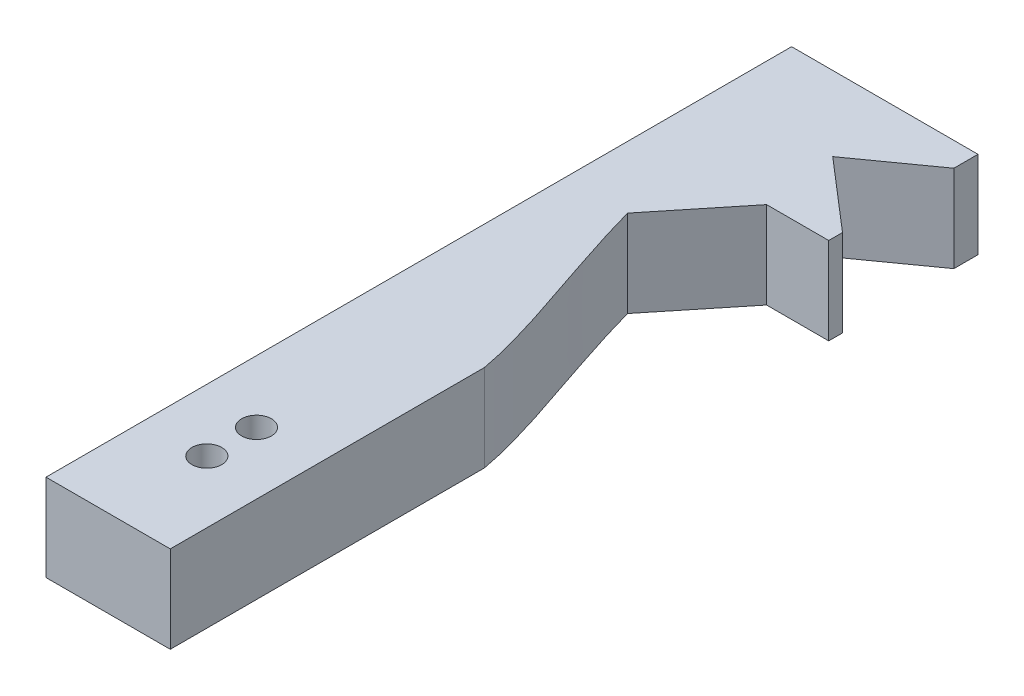
ISO-10303-21;
HEADER;
FILE_DESCRIPTION(('STEP AP214'),'2;1');
FILE_NAME('part.step','',(''),(''),'','','');
FILE_SCHEMA(('AUTOMOTIVE_DESIGN { 1 0 10303 214 1 1 1 1 }'));
ENDSEC;
DATA;
#1=APPLICATION_CONTEXT('core data for automotive mechanical design processes');
#2=APPLICATION_PROTOCOL_DEFINITION('international standard','automotive_design',2000,#1);
#3=PRODUCT_CONTEXT('',#1,'mechanical');
#4=PRODUCT('Part','Part','',(#3));
#5=PRODUCT_RELATED_PRODUCT_CATEGORY('part','',(#4));
#6=PRODUCT_DEFINITION_FORMATION('','',#4);
#7=PRODUCT_DEFINITION_CONTEXT('part definition',#1,'design');
#8=PRODUCT_DEFINITION('design','',#6,#7);
#9=PRODUCT_DEFINITION_SHAPE('','',#8);
#10=(LENGTH_UNIT() NAMED_UNIT(*) SI_UNIT(.MILLI.,.METRE.));
#11=(NAMED_UNIT(*) PLANE_ANGLE_UNIT() SI_UNIT($,.RADIAN.));
#12=(NAMED_UNIT(*) SI_UNIT($,.STERADIAN.) SOLID_ANGLE_UNIT());
#13=UNCERTAINTY_MEASURE_WITH_UNIT(LENGTH_MEASURE(1.E-05),#10,'distance_accuracy_value','');
#14=(GEOMETRIC_REPRESENTATION_CONTEXT(3) GLOBAL_UNCERTAINTY_ASSIGNED_CONTEXT((#13)) GLOBAL_UNIT_ASSIGNED_CONTEXT((#10,
#11,#12)) REPRESENTATION_CONTEXT('',''));
#15=CARTESIAN_POINT('',(0.,0.,0.));
#16=DIRECTION('',(0.,0.,1.));
#17=DIRECTION('',(1.,0.,0.));
#18=AXIS2_PLACEMENT_3D('',#15,#16,#17);
#19=CARTESIAN_POINT('',(10.,0.,0.));
#20=DIRECTION('',(1.,0.,0.));
#21=DIRECTION('',(0.,0.,-1.));
#22=AXIS2_PLACEMENT_3D('',#19,#20,#21);
#23=PLANE('',#22);
#24=DIRECTION('',(0.,1.,0.));
#25=VECTOR('',#24,1.);
#26=CARTESIAN_POINT('',(10.,0.,-19.0964891001522));
#27=LINE('',#26,#25);
#28=CARTESIAN_POINT('',(10.,0.,-19.0964891001522));
#29=VERTEX_POINT('',#28);
#30=CARTESIAN_POINT('',(10.,7.,-19.0964891001522));
#31=VERTEX_POINT('',#30);
#32=EDGE_CURVE('E226',#29,#31,#27,.T.);
#33=ORIENTED_EDGE('',*,*,#32,.T.);
#34=DIRECTION('',(0.,0.,1.));
#35=VECTOR('',#34,1.);
#36=CARTESIAN_POINT('',(10.,7.,-17.98712043761));
#37=LINE('',#36,#35);
#38=CARTESIAN_POINT('',(10.,7.,-17.98712043761));
#39=VERTEX_POINT('',#38);
#40=EDGE_CURVE('E231',#31,#39,#37,.T.);
#41=ORIENTED_EDGE('',*,*,#40,.T.);
#42=DIRECTION('',(0.,-1.,0.));
#43=VECTOR('',#42,1.);
#44=CARTESIAN_POINT('',(10.,7.,-17.98712043761));
#45=LINE('',#44,#43);
#46=CARTESIAN_POINT('',(10.,0.,-17.98712043761));
#47=VERTEX_POINT('',#46);
#48=EDGE_CURVE('E219',#39,#47,#45,.T.);
#49=ORIENTED_EDGE('',*,*,#48,.T.);
#50=DIRECTION('',(0.,0.,-1.));
#51=VECTOR('',#50,1.);
#52=CARTESIAN_POINT('',(10.,0.,-17.98712043761));
#53=LINE('',#52,#51);
#54=EDGE_CURVE('E218',#47,#29,#53,.T.);
#55=ORIENTED_EDGE('',*,*,#54,.T.);
#56=EDGE_LOOP('',(#33,#41,#49,#55));
#57=FACE_BOUND('',#56,.T.);
#58=ADVANCED_FACE('F47',(#57),#23,.T.);
#59=CARTESIAN_POINT('',(0.,7.,-30.));
#60=DIRECTION('',(0.,0.,-1.));
#61=DIRECTION('',(-1.,0.,0.));
#62=AXIS2_PLACEMENT_3D('',#59,#60,#61);
#63=PLANE('',#62);
#64=DIRECTION('',(1.,0.,0.));
#65=VECTOR('',#64,1.);
#66=CARTESIAN_POINT('',(0.,0.,-30.));
#67=LINE('',#66,#65);
#68=CARTESIAN_POINT('',(-5.,0.,-30.));
#69=VERTEX_POINT('',#68);
#70=CARTESIAN_POINT('',(10.,0.,-30.));
#71=VERTEX_POINT('',#70);
#72=EDGE_CURVE('E215',#69,#71,#67,.T.);
#73=ORIENTED_EDGE('',*,*,#72,.F.);
#74=DIRECTION('',(0.,-1.,0.));
#75=VECTOR('',#74,1.);
#76=CARTESIAN_POINT('',(-5.,7.,-30.));
#77=LINE('',#76,#75);
#78=CARTESIAN_POINT('',(-5.,7.,-30.));
#79=VERTEX_POINT('',#78);
#80=EDGE_CURVE('E11',#79,#69,#77,.T.);
#81=ORIENTED_EDGE('',*,*,#80,.F.);
#82=DIRECTION('',(1.,0.,0.));
#83=VECTOR('',#82,1.);
#84=CARTESIAN_POINT('',(0.,7.,-30.));
#85=LINE('',#84,#83);
#86=CARTESIAN_POINT('',(10.,7.,-30.));
#87=VERTEX_POINT('',#86);
#88=EDGE_CURVE('E240',#79,#87,#85,.T.);
#89=ORIENTED_EDGE('',*,*,#88,.T.);
#90=DIRECTION('',(0.,1.,0.));
#91=VECTOR('',#90,1.);
#92=CARTESIAN_POINT('',(10.,7.,-30.));
#93=LINE('',#92,#91);
#94=EDGE_CURVE('E224',#71,#87,#93,.T.);
#95=ORIENTED_EDGE('',*,*,#94,.F.);
#96=EDGE_LOOP('',(#73,#81,#89,#95));
#97=FACE_BOUND('',#96,.T.);
#98=ADVANCED_FACE('F49',(#97),#63,.T.);
#99=CARTESIAN_POINT('',(-5.,7.,0.));
#100=DIRECTION('',(1.,0.,0.));
#101=DIRECTION('',(0.,0.,-1.));
#102=AXIS2_PLACEMENT_3D('',#99,#100,#101);
#103=PLANE('',#102);
#104=DIRECTION('',(0.,0.,1.));
#105=VECTOR('',#104,1.);
#106=CARTESIAN_POINT('',(-5.,0.,0.));
#107=LINE('',#106,#105);
#108=CARTESIAN_POINT('',(-5.,0.,30.));
#109=VERTEX_POINT('',#108);
#110=EDGE_CURVE('E256',#69,#109,#107,.T.);
#111=ORIENTED_EDGE('',*,*,#110,.T.);
#112=DIRECTION('',(0.,-1.,0.));
#113=VECTOR('',#112,1.);
#114=CARTESIAN_POINT('',(-5.,7.,30.));
#115=LINE('',#114,#113);
#116=CARTESIAN_POINT('',(-5.,7.,30.));
#117=VERTEX_POINT('',#116);
#118=EDGE_CURVE('E56',#117,#109,#115,.T.);
#119=ORIENTED_EDGE('',*,*,#118,.F.);
#120=DIRECTION('',(0.,0.,1.));
#121=VECTOR('',#120,1.);
#122=CARTESIAN_POINT('',(-5.,7.,0.));
#123=LINE('',#122,#121);
#124=EDGE_CURVE('E124',#79,#117,#123,.T.);
#125=ORIENTED_EDGE('',*,*,#124,.F.);
#126=ORIENTED_EDGE('',*,*,#80,.T.);
#127=EDGE_LOOP('',(#111,#119,#125,#126));
#128=FACE_BOUND('',#127,.T.);
#129=ADVANCED_FACE('F167',(#128),#103,.F.);
#130=CARTESIAN_POINT('',(0.,7.,30.));
#131=DIRECTION('',(0.,0.,-1.));
#132=DIRECTION('',(-1.,0.,0.));
#133=AXIS2_PLACEMENT_3D('',#130,#131,#132);
#134=PLANE('',#133);
#135=DIRECTION('',(1.,0.,0.));
#136=VECTOR('',#135,1.);
#137=CARTESIAN_POINT('',(0.,0.,30.));
#138=LINE('',#137,#136);
#139=CARTESIAN_POINT('',(5.,0.,30.));
#140=VERTEX_POINT('',#139);
#141=EDGE_CURVE('E134',#109,#140,#138,.T.);
#142=ORIENTED_EDGE('',*,*,#141,.T.);
#143=DIRECTION('',(0.,-1.,0.));
#144=VECTOR('',#143,1.);
#145=CARTESIAN_POINT('',(5.,7.,30.));
#146=LINE('',#145,#144);
#147=CARTESIAN_POINT('',(5.,7.,30.));
#148=VERTEX_POINT('',#147);
#149=EDGE_CURVE('E131',#148,#140,#146,.T.);
#150=ORIENTED_EDGE('',*,*,#149,.F.);
#151=DIRECTION('',(1.,0.,0.));
#152=VECTOR('',#151,1.);
#153=CARTESIAN_POINT('',(0.,7.,30.));
#154=LINE('',#153,#152);
#155=EDGE_CURVE('E117',#117,#148,#154,.T.);
#156=ORIENTED_EDGE('',*,*,#155,.F.);
#157=ORIENTED_EDGE('',*,*,#118,.T.);
#158=EDGE_LOOP('',(#142,#150,#156,#157));
#159=FACE_BOUND('',#158,.T.);
#160=ADVANCED_FACE('F132',(#159),#134,.F.);
#161=CARTESIAN_POINT('',(5.,7.,0.));
#162=DIRECTION('',(1.,0.,0.));
#163=DIRECTION('',(0.,0.,-1.));
#164=AXIS2_PLACEMENT_3D('',#161,#162,#163);
#165=PLANE('',#164);
#166=DIRECTION('',(0.,0.,1.));
#167=VECTOR('',#166,1.);
#168=CARTESIAN_POINT('',(5.,0.,0.));
#169=LINE('',#168,#167);
#170=CARTESIAN_POINT('',(5.,0.,4.72679160911349));
#171=VERTEX_POINT('',#170);
#172=EDGE_CURVE('E251',#171,#140,#169,.T.);
#173=ORIENTED_EDGE('',*,*,#172,.F.);
#174=DIRECTION('',(0.,-1.,0.));
#175=VECTOR('',#174,1.);
#176=CARTESIAN_POINT('',(5.,7.,4.72679160911349));
#177=LINE('',#176,#175);
#178=CARTESIAN_POINT('',(5.,7.,4.72679160911349));
#179=VERTEX_POINT('',#178);
#180=EDGE_CURVE('E139',#179,#171,#177,.T.);
#181=ORIENTED_EDGE('',*,*,#180,.F.);
#182=DIRECTION('',(0.,0.,1.));
#183=VECTOR('',#182,1.);
#184=CARTESIAN_POINT('',(5.,7.,0.));
#185=LINE('',#184,#183);
#186=EDGE_CURVE('E122',#179,#148,#185,.T.);
#187=ORIENTED_EDGE('',*,*,#186,.T.);
#188=ORIENTED_EDGE('',*,*,#149,.T.);
#189=EDGE_LOOP('',(#173,#181,#187,#188));
#190=FACE_BOUND('',#189,.T.);
#191=ADVANCED_FACE('F141',(#190),#165,.T.);
#192=CARTESIAN_POINT('',(5.,7.,-30.));
#193=CARTESIAN_POINT('',(-10.3529358461253,7.,-22.9239770738353));
#194=CARTESIAN_POINT('',(7.62718964271242,7.,0.454696940651273));
#195=CARTESIAN_POINT('',(5.,7.,9.52292147432202));
#196=B_SPLINE_CURVE_WITH_KNOTS('',3,(#192,#193,#194,#195),.UNSPECIFIED.,.F.,.F.,(4,4),(0.,1.),.UNSPECIFIED.);
#197=DIRECTION('',(0.,-1.,0.));
#198=VECTOR('',#197,1.);
#199=SURFACE_OF_LINEAR_EXTRUSION('',#196,#198);
#200=CARTESIAN_POINT('',(5.,0.,-30.));
#201=CARTESIAN_POINT('',(-10.3529358461253,0.,-22.9239770738353));
#202=CARTESIAN_POINT('',(7.62718964271242,0.,0.454696940651273));
#203=CARTESIAN_POINT('',(5.,0.,9.52292147432202));
#204=B_SPLINE_CURVE_WITH_KNOTS('',3,(#200,#201,#202,#203),.UNSPECIFIED.,.F.,.F.,(4,4),(0.,1.),.UNSPECIFIED.);
#205=CARTESIAN_POINT('',(0.,0.,-11.8027185130807));
#206=VERTEX_POINT('',#205);
#207=EDGE_CURVE('E247',#206,#171,#204,.T.);
#208=ORIENTED_EDGE('',*,*,#207,.F.);
#209=DIRECTION('',(0.,-1.,0.));
#210=VECTOR('',#209,1.);
#211=CARTESIAN_POINT('',(0.,7.,-11.8027185130807));
#212=LINE('',#211,#210);
#213=CARTESIAN_POINT('',(0.,7.,-11.8027185130807));
#214=VERTEX_POINT('',#213);
#215=EDGE_CURVE('E72',#214,#206,#212,.T.);
#216=ORIENTED_EDGE('',*,*,#215,.F.);
#217=EDGE_CURVE('E143',#214,#179,#196,.T.);
#218=ORIENTED_EDGE('',*,*,#217,.T.);
#219=ORIENTED_EDGE('',*,*,#180,.T.);
#220=EDGE_LOOP('',(#208,#216,#218,#219));
#221=FACE_BOUND('',#220,.T.);
#222=ADVANCED_FACE('F158',(#221),#199,.T.);
#223=CARTESIAN_POINT('',(-5.77046773410164,7.,-4.66534016103811));
#224=DIRECTION('',(0.777639540258396,0.,0.628710382789016));
#225=DIRECTION('',(0.628710382789016,0.,-0.777639540258396));
#226=AXIS2_PLACEMENT_3D('',#223,#224,#225);
#227=PLANE('',#226);
#228=DIRECTION('',(-0.628710382789016,0.,0.777639540258396));
#229=VECTOR('',#228,1.);
#230=CARTESIAN_POINT('',(-5.77046773410164,0.,-4.66534016103811));
#231=LINE('',#230,#229);
#232=CARTESIAN_POINT('',(5.,0.,-17.98712043761));
#233=VERTEX_POINT('',#232);
#234=EDGE_CURVE('E242',#233,#206,#231,.T.);
#235=ORIENTED_EDGE('',*,*,#234,.F.);
#236=DIRECTION('',(0.,-1.,0.));
#237=VECTOR('',#236,1.);
#238=CARTESIAN_POINT('',(5.,7.,-17.98712043761));
#239=LINE('',#238,#237);
#240=CARTESIAN_POINT('',(5.,7.,-17.98712043761));
#241=VERTEX_POINT('',#240);
#242=EDGE_CURVE('E99',#241,#233,#239,.T.);
#243=ORIENTED_EDGE('',*,*,#242,.F.);
#244=DIRECTION('',(-0.628710382789016,0.,0.777639540258396));
#245=VECTOR('',#244,1.);
#246=CARTESIAN_POINT('',(-5.77046773410164,7.,-4.66534016103811));
#247=LINE('',#246,#245);
#248=EDGE_CURVE('E146',#241,#214,#247,.T.);
#249=ORIENTED_EDGE('',*,*,#248,.T.);
#250=ORIENTED_EDGE('',*,*,#215,.T.);
#251=EDGE_LOOP('',(#235,#243,#249,#250));
#252=FACE_BOUND('',#251,.T.);
#253=ADVANCED_FACE('F162',(#252),#227,.T.);
#254=CARTESIAN_POINT('',(0.,7.,0.));
#255=DIRECTION('',(0.,1.,0.));
#256=DIRECTION('',(0.,0.,1.));
#257=AXIS2_PLACEMENT_3D('',#254,#255,#256);
#258=PLANE('',#257);
#259=CARTESIAN_POINT('',(0.,7.,22.0596760083896));
#260=DIRECTION('',(0.,1.,0.));
#261=DIRECTION('',(0.,0.,1.));
#262=AXIS2_PLACEMENT_3D('',#259,#260,#261);
#263=CIRCLE('',#262,1.2);
#264=CARTESIAN_POINT('',(0.,7.,23.2596760083896));
#265=VERTEX_POINT('',#264);
#266=EDGE_CURVE('E291',#265,#265,#263,.T.);
#267=ORIENTED_EDGE('',*,*,#266,.F.);
#268=EDGE_LOOP('',(#267));
#269=FACE_BOUND('',#268,.T.);
#270=CARTESIAN_POINT('',(0.,7.,18.0596760083896));
#271=DIRECTION('',(0.,1.,0.));
#272=DIRECTION('',(0.,0.,1.));
#273=AXIS2_PLACEMENT_3D('',#270,#271,#272);
#274=CIRCLE('',#273,1.2);
#275=CARTESIAN_POINT('',(0.,7.,19.2596760083896));
#276=VERTEX_POINT('',#275);
#277=EDGE_CURVE('E313',#276,#276,#274,.T.);
#278=ORIENTED_EDGE('',*,*,#277,.F.);
#279=EDGE_LOOP('',(#278));
#280=FACE_BOUND('',#279,.T.);
#281=DIRECTION('',(0.757627877637291,0.,0.652686754137706));
#282=VECTOR('',#281,1.);
#283=CARTESIAN_POINT('',(4.31556167680239,7.,-23.993560218805));
#284=LINE('',#283,#282);
#285=CARTESIAN_POINT('',(4.31556167680239,7.,-23.993560218805));
#286=VERTEX_POINT('',#285);
#287=EDGE_CURVE('E282',#286,#31,#284,.T.);
#288=ORIENTED_EDGE('',*,*,#287,.F.);
#289=DIRECTION('',(-0.8134019471469,0.,0.581702047768127));
#290=VECTOR('',#289,1.);
#291=CARTESIAN_POINT('',(10.,7.,-28.0587698296427));
#292=LINE('',#291,#290);
#293=CARTESIAN_POINT('',(10.,7.,-28.0587698296427));
#294=VERTEX_POINT('',#293);
#295=EDGE_CURVE('E279',#294,#286,#292,.T.);
#296=ORIENTED_EDGE('',*,*,#295,.F.);
#297=EDGE_CURVE('E204',#87,#294,#37,.T.);
#298=ORIENTED_EDGE('',*,*,#297,.F.);
#299=ORIENTED_EDGE('',*,*,#88,.F.);
#300=ORIENTED_EDGE('',*,*,#124,.T.);
#301=ORIENTED_EDGE('',*,*,#155,.T.);
#302=ORIENTED_EDGE('',*,*,#186,.F.);
#303=ORIENTED_EDGE('',*,*,#217,.F.);
#304=ORIENTED_EDGE('',*,*,#248,.F.);
#305=DIRECTION('',(-1.,0.,0.));
#306=VECTOR('',#305,1.);
#307=CARTESIAN_POINT('',(10.,7.,-17.98712043761));
#308=LINE('',#307,#306);
#309=EDGE_CURVE('E234',#39,#241,#308,.T.);
#310=ORIENTED_EDGE('',*,*,#309,.F.);
#311=ORIENTED_EDGE('',*,*,#40,.F.);
#312=EDGE_LOOP('',(#288,#296,#298,#299,#300,#301,#302,#303,#304,#310,#311));
#313=FACE_BOUND('',#312,.T.);
#314=ADVANCED_FACE('F120',(#269,#280,#313),#258,.T.);
#315=CARTESIAN_POINT('',(0.,0.,0.));
#316=DIRECTION('',(0.,1.,0.));
#317=DIRECTION('',(0.,0.,1.));
#318=AXIS2_PLACEMENT_3D('',#315,#316,#317);
#319=PLANE('',#318);
#320=CARTESIAN_POINT('',(0.,0.,22.0596760083896));
#321=DIRECTION('',(0.,1.,0.));
#322=DIRECTION('',(0.,0.,1.));
#323=AXIS2_PLACEMENT_3D('',#320,#321,#322);
#324=CIRCLE('',#323,1.2);
#325=CARTESIAN_POINT('',(0.,0.,23.2596760083896));
#326=VERTEX_POINT('',#325);
#327=EDGE_CURVE('E285',#326,#326,#324,.T.);
#328=ORIENTED_EDGE('',*,*,#327,.T.);
#329=EDGE_LOOP('',(#328));
#330=FACE_BOUND('',#329,.T.);
#331=CARTESIAN_POINT('',(0.,0.,18.0596760083896));
#332=DIRECTION('',(0.,1.,0.));
#333=DIRECTION('',(0.,0.,1.));
#334=AXIS2_PLACEMENT_3D('',#331,#332,#333);
#335=CIRCLE('',#334,1.2);
#336=CARTESIAN_POINT('',(0.,0.,19.2596760083896));
#337=VERTEX_POINT('',#336);
#338=EDGE_CURVE('E309',#337,#337,#335,.T.);
#339=ORIENTED_EDGE('',*,*,#338,.T.);
#340=EDGE_LOOP('',(#339));
#341=FACE_BOUND('',#340,.T.);
#342=DIRECTION('',(-0.8134019471469,0.,0.581702047768127));
#343=VECTOR('',#342,1.);
#344=CARTESIAN_POINT('',(10.,0.,-28.0587698296427));
#345=LINE('',#344,#343);
#346=CARTESIAN_POINT('',(10.,0.,-28.0587698296427));
#347=VERTEX_POINT('',#346);
#348=CARTESIAN_POINT('',(4.31556167680239,0.,-23.993560218805));
#349=VERTEX_POINT('',#348);
#350=EDGE_CURVE('E63',#347,#349,#345,.T.);
#351=ORIENTED_EDGE('',*,*,#350,.T.);
#352=DIRECTION('',(0.757627877637291,0.,0.652686754137706));
#353=VECTOR('',#352,1.);
#354=CARTESIAN_POINT('',(4.31556167680239,0.,-23.993560218805));
#355=LINE('',#354,#353);
#356=EDGE_CURVE('E209',#349,#29,#355,.T.);
#357=ORIENTED_EDGE('',*,*,#356,.T.);
#358=ORIENTED_EDGE('',*,*,#54,.F.);
#359=DIRECTION('',(-1.,0.,0.));
#360=VECTOR('',#359,1.);
#361=CARTESIAN_POINT('',(10.,0.,-17.98712043761));
#362=LINE('',#361,#360);
#363=EDGE_CURVE('E237',#47,#233,#362,.T.);
#364=ORIENTED_EDGE('',*,*,#363,.T.);
#365=ORIENTED_EDGE('',*,*,#234,.T.);
#366=ORIENTED_EDGE('',*,*,#207,.T.);
#367=ORIENTED_EDGE('',*,*,#172,.T.);
#368=ORIENTED_EDGE('',*,*,#141,.F.);
#369=ORIENTED_EDGE('',*,*,#110,.F.);
#370=ORIENTED_EDGE('',*,*,#72,.T.);
#371=EDGE_CURVE('E200',#347,#71,#53,.T.);
#372=ORIENTED_EDGE('',*,*,#371,.F.);
#373=EDGE_LOOP('',(#351,#357,#358,#364,#365,#366,#367,#368,#369,#370,#372));
#374=FACE_BOUND('',#373,.T.);
#375=ADVANCED_FACE('F193',(#330,#341,#374),#319,.F.);
#376=CARTESIAN_POINT('',(10.,7.,-17.98712043761));
#377=DIRECTION('',(0.,0.,-1.));
#378=DIRECTION('',(-1.,0.,0.));
#379=AXIS2_PLACEMENT_3D('',#376,#377,#378);
#380=PLANE('',#379);
#381=ORIENTED_EDGE('',*,*,#242,.T.);
#382=ORIENTED_EDGE('',*,*,#363,.F.);
#383=ORIENTED_EDGE('',*,*,#48,.F.);
#384=ORIENTED_EDGE('',*,*,#309,.T.);
#385=EDGE_LOOP('',(#381,#382,#383,#384));
#386=FACE_BOUND('',#385,.T.);
#387=ADVANCED_FACE('F185',(#386),#380,.F.);
#388=DIRECTION('',(0.,1.,0.));
#389=VECTOR('',#388,1.);
#390=CARTESIAN_POINT('',(10.,0.,-28.0587698296427));
#391=LINE('',#390,#389);
#392=EDGE_CURVE('E196',#347,#294,#391,.T.);
#393=ORIENTED_EDGE('',*,*,#392,.F.);
#394=ORIENTED_EDGE('',*,*,#371,.T.);
#395=ORIENTED_EDGE('',*,*,#94,.T.);
#396=ORIENTED_EDGE('',*,*,#297,.T.);
#397=EDGE_LOOP('',(#393,#394,#395,#396));
#398=FACE_BOUND('',#397,.T.);
#399=ADVANCED_FACE('F176',(#398),#23,.T.);
#400=CARTESIAN_POINT('',(4.31556167680239,0.,-23.993560218805));
#401=DIRECTION('',(-0.652686754137706,0.,0.757627877637291));
#402=DIRECTION('',(0.757627877637291,0.,0.652686754137706));
#403=AXIS2_PLACEMENT_3D('',#400,#401,#402);
#404=PLANE('',#403);
#405=ORIENTED_EDGE('',*,*,#287,.T.);
#406=ORIENTED_EDGE('',*,*,#32,.F.);
#407=ORIENTED_EDGE('',*,*,#356,.F.);
#408=DIRECTION('',(0.,1.,0.));
#409=VECTOR('',#408,1.);
#410=CARTESIAN_POINT('',(4.31556167680239,0.,-23.993560218805));
#411=LINE('',#410,#409);
#412=EDGE_CURVE('E208',#349,#286,#411,.T.);
#413=ORIENTED_EDGE('',*,*,#412,.T.);
#414=EDGE_LOOP('',(#405,#406,#407,#413));
#415=FACE_BOUND('',#414,.T.);
#416=ADVANCED_FACE('F184',(#415),#404,.F.);
#417=CARTESIAN_POINT('',(10.,0.,-28.0587698296427));
#418=DIRECTION('',(-0.581702047768127,0.,-0.8134019471469));
#419=DIRECTION('',(-0.8134019471469,0.,0.581702047768127));
#420=AXIS2_PLACEMENT_3D('',#417,#418,#419);
#421=PLANE('',#420);
#422=ORIENTED_EDGE('',*,*,#295,.T.);
#423=ORIENTED_EDGE('',*,*,#412,.F.);
#424=ORIENTED_EDGE('',*,*,#350,.F.);
#425=ORIENTED_EDGE('',*,*,#392,.T.);
#426=EDGE_LOOP('',(#422,#423,#424,#425));
#427=FACE_BOUND('',#426,.T.);
#428=ADVANCED_FACE('F190',(#427),#421,.F.);
#429=CARTESIAN_POINT('',(0.,0.,18.0596760083896));
#430=DIRECTION('',(0.,1.,0.));
#431=DIRECTION('',(0.,0.,1.));
#432=AXIS2_PLACEMENT_3D('',#429,#430,#431);
#433=CYLINDRICAL_SURFACE('',#432,1.2);
#434=ORIENTED_EDGE('',*,*,#338,.F.);
#435=EDGE_LOOP('',(#434));
#436=FACE_BOUND('',#435,.T.);
#437=ORIENTED_EDGE('',*,*,#277,.T.);
#438=EDGE_LOOP('',(#437));
#439=FACE_BOUND('',#438,.T.);
#440=ADVANCED_FACE('F328',(#436,#439),#433,.F.);
#441=CARTESIAN_POINT('',(0.,0.,22.0596760083896));
#442=DIRECTION('',(0.,1.,0.));
#443=DIRECTION('',(0.,0.,1.));
#444=AXIS2_PLACEMENT_3D('',#441,#442,#443);
#445=CYLINDRICAL_SURFACE('',#444,1.2);
#446=ORIENTED_EDGE('',*,*,#327,.F.);
#447=EDGE_LOOP('',(#446));
#448=FACE_BOUND('',#447,.T.);
#449=ORIENTED_EDGE('',*,*,#266,.T.);
#450=EDGE_LOOP('',(#449));
#451=FACE_BOUND('',#450,.T.);
#452=ADVANCED_FACE('F321',(#448,#451),#445,.F.);
#453=CLOSED_SHELL('',(#58,#98,#129,#160,#191,#222,#253,#314,#375,#387,#399,#416,#428,#440,#452));
#454=MANIFOLD_SOLID_BREP('B2',#453);
#455=ADVANCED_BREP_SHAPE_REPRESENTATION('',(#18,#454),#14);
#456=SHAPE_DEFINITION_REPRESENTATION(#9,#455);
ENDSEC;
END-ISO-10303-21;
